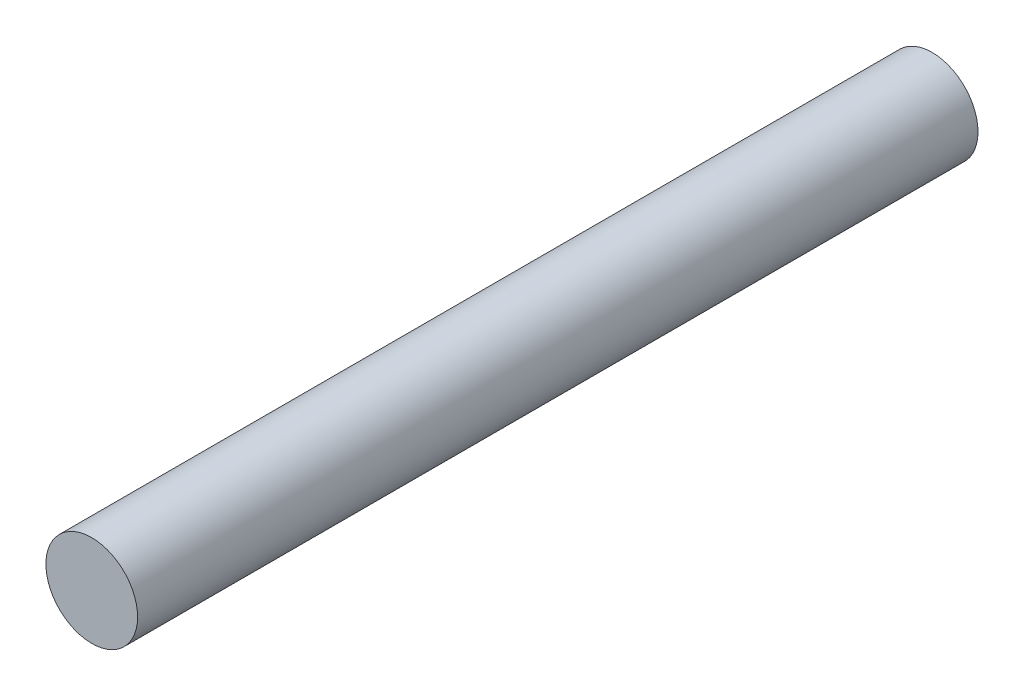
ISO-10303-21;
HEADER;
FILE_DESCRIPTION(('STEP AP214'),'2;1');
FILE_NAME('part.step','',(''),(''),'','','');
FILE_SCHEMA(('AUTOMOTIVE_DESIGN { 1 0 10303 214 1 1 1 1 }'));
ENDSEC;
DATA;
#1=APPLICATION_CONTEXT('core data for automotive mechanical design processes');
#2=APPLICATION_PROTOCOL_DEFINITION('international standard','automotive_design',2000,#1);
#3=PRODUCT_CONTEXT('',#1,'mechanical');
#4=PRODUCT('Part','Part','',(#3));
#5=PRODUCT_RELATED_PRODUCT_CATEGORY('part','',(#4));
#6=PRODUCT_DEFINITION_FORMATION('','',#4);
#7=PRODUCT_DEFINITION_CONTEXT('part definition',#1,'design');
#8=PRODUCT_DEFINITION('design','',#6,#7);
#9=PRODUCT_DEFINITION_SHAPE('','',#8);
#10=(LENGTH_UNIT() NAMED_UNIT(*) SI_UNIT(.MILLI.,.METRE.));
#11=(NAMED_UNIT(*) PLANE_ANGLE_UNIT() SI_UNIT($,.RADIAN.));
#12=(NAMED_UNIT(*) SI_UNIT($,.STERADIAN.) SOLID_ANGLE_UNIT());
#13=UNCERTAINTY_MEASURE_WITH_UNIT(LENGTH_MEASURE(1.E-05),#10,'distance_accuracy_value','');
#14=(GEOMETRIC_REPRESENTATION_CONTEXT(3) GLOBAL_UNCERTAINTY_ASSIGNED_CONTEXT((#13)) GLOBAL_UNIT_ASSIGNED_CONTEXT((#10,
#11,#12)) REPRESENTATION_CONTEXT('',''));
#15=CARTESIAN_POINT('',(0.,0.,0.));
#16=DIRECTION('',(0.,0.,1.));
#17=DIRECTION('',(1.,0.,0.));
#18=AXIS2_PLACEMENT_3D('',#15,#16,#17);
#19=CARTESIAN_POINT('',(0.,0.,0.));
#20=DIRECTION('',(0.,0.,-1.));
#21=DIRECTION('',(1.,0.,0.));
#22=AXIS2_PLACEMENT_3D('',#19,#20,#21);
#23=CYLINDRICAL_SURFACE('',#22,0.2999994);
#24=CARTESIAN_POINT('',(0.,0.,0.));
#25=DIRECTION('',(0.,0.,1.));
#26=DIRECTION('',(1.,0.,0.));
#27=AXIS2_PLACEMENT_3D('',#24,#25,#26);
#28=CIRCLE('',#27,0.2999994);
#29=CARTESIAN_POINT('',(0.2999994,0.,0.));
#30=VERTEX_POINT('',#29);
#31=EDGE_CURVE('E11',#30,#30,#28,.T.);
#32=ORIENTED_EDGE('',*,*,#31,.T.);
#33=DIRECTION('',(0.,0.,1.));
#34=VECTOR('',#33,1.);
#35=CARTESIAN_POINT('',(0.2999994,0.,0.));
#36=LINE('',#35,#34);
#37=CARTESIAN_POINT('',(0.2999994,0.,5.49999916));
#38=VERTEX_POINT('',#37);
#39=EDGE_CURVE('E23',#30,#38,#36,.T.);
#40=ORIENTED_EDGE('',*,*,#39,.T.);
#41=CARTESIAN_POINT('',(0.,0.,5.49999916));
#42=DIRECTION('',(0.,0.,1.));
#43=DIRECTION('',(1.,0.,0.));
#44=AXIS2_PLACEMENT_3D('',#41,#42,#43);
#45=CIRCLE('',#44,0.2999994);
#46=EDGE_CURVE('E31',#38,#38,#45,.T.);
#47=ORIENTED_EDGE('',*,*,#46,.F.);
#48=ORIENTED_EDGE('',*,*,#39,.F.);
#49=EDGE_LOOP('',(#32,#40,#47,#48));
#50=FACE_BOUND('',#49,.T.);
#51=ADVANCED_FACE('F16',(#50),#23,.T.);
#52=CARTESIAN_POINT('',(0.2999994,0.,0.));
#53=DIRECTION('',(0.,0.,-1.));
#54=DIRECTION('',(-1.,0.,0.));
#55=AXIS2_PLACEMENT_3D('',#52,#53,#54);
#56=PLANE('',#55);
#57=ORIENTED_EDGE('',*,*,#31,.F.);
#58=EDGE_LOOP('',(#57));
#59=FACE_BOUND('',#58,.T.);
#60=ADVANCED_FACE('F36',(#59),#56,.T.);
#61=CARTESIAN_POINT('',(0.2999994,0.,5.49999916));
#62=DIRECTION('',(0.,0.,-1.));
#63=DIRECTION('',(-1.,0.,0.));
#64=AXIS2_PLACEMENT_3D('',#61,#62,#63);
#65=PLANE('',#64);
#66=ORIENTED_EDGE('',*,*,#46,.T.);
#67=EDGE_LOOP('',(#66));
#68=FACE_BOUND('',#67,.T.);
#69=ADVANCED_FACE('F33',(#68),#65,.F.);
#70=CLOSED_SHELL('',(#51,#60,#69));
#71=MANIFOLD_SOLID_BREP('B1',#70);
#72=ADVANCED_BREP_SHAPE_REPRESENTATION('',(#18,#71),#14);
#73=SHAPE_DEFINITION_REPRESENTATION(#9,#72);
ENDSEC;
END-ISO-10303-21;
